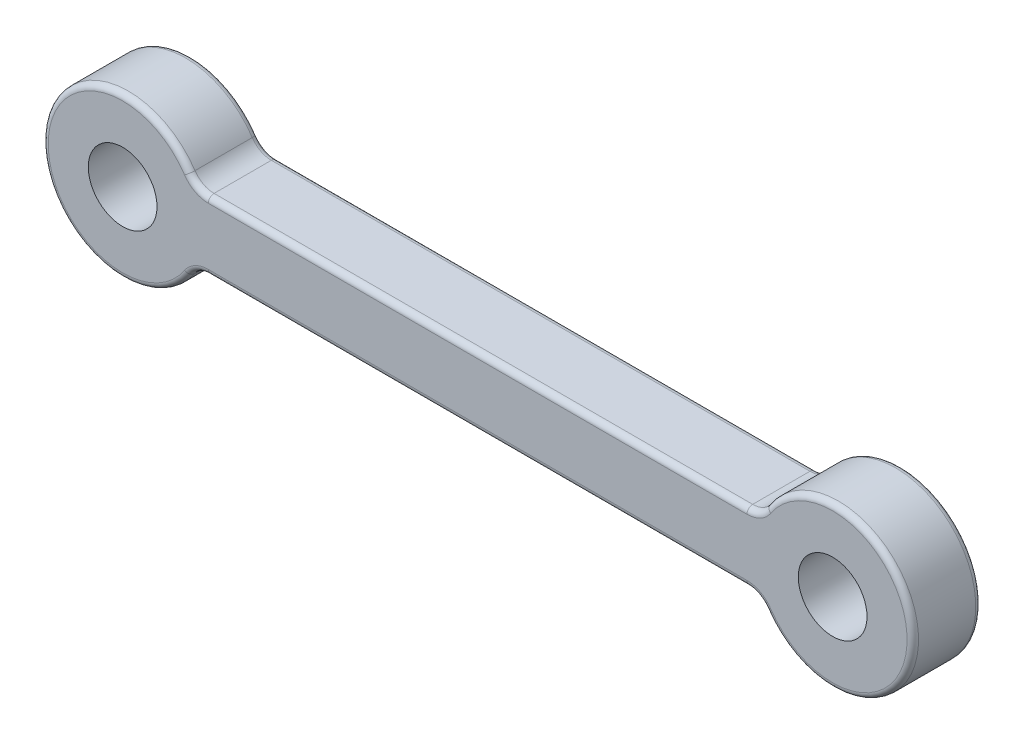
ISO-10303-21;
HEADER;
FILE_DESCRIPTION(('STEP AP214'),'2;1');
FILE_NAME('part.step','',(''),(''),'','','');
FILE_SCHEMA(('AUTOMOTIVE_DESIGN { 1 0 10303 214 1 1 1 1 }'));
ENDSEC;
DATA;
#1=APPLICATION_CONTEXT('core data for automotive mechanical design processes');
#2=APPLICATION_PROTOCOL_DEFINITION('international standard','automotive_design',2000,#1);
#3=PRODUCT_CONTEXT('',#1,'mechanical');
#4=PRODUCT('Part','Part','',(#3));
#5=PRODUCT_RELATED_PRODUCT_CATEGORY('part','',(#4));
#6=PRODUCT_DEFINITION_FORMATION('','',#4);
#7=PRODUCT_DEFINITION_CONTEXT('part definition',#1,'design');
#8=PRODUCT_DEFINITION('design','',#6,#7);
#9=PRODUCT_DEFINITION_SHAPE('','',#8);
#10=(LENGTH_UNIT() NAMED_UNIT(*) SI_UNIT(.MILLI.,.METRE.));
#11=(NAMED_UNIT(*) PLANE_ANGLE_UNIT() SI_UNIT($,.RADIAN.));
#12=(NAMED_UNIT(*) SI_UNIT($,.STERADIAN.) SOLID_ANGLE_UNIT());
#13=UNCERTAINTY_MEASURE_WITH_UNIT(LENGTH_MEASURE(1.E-05),#10,'distance_accuracy_value','');
#14=(GEOMETRIC_REPRESENTATION_CONTEXT(3) GLOBAL_UNCERTAINTY_ASSIGNED_CONTEXT((#13)) GLOBAL_UNIT_ASSIGNED_CONTEXT((#10,
#11,#12)) REPRESENTATION_CONTEXT('',''));
#15=CARTESIAN_POINT('',(0.,0.,0.));
#16=DIRECTION('',(0.,0.,1.));
#17=DIRECTION('',(1.,0.,0.));
#18=AXIS2_PLACEMENT_3D('',#15,#16,#17);
#19=CARTESIAN_POINT('',(0.,0.,3.));
#20=DIRECTION('',(0.,0.,-1.));
#21=DIRECTION('',(-1.,0.,0.));
#22=AXIS2_PLACEMENT_3D('',#19,#20,#21);
#23=CYLINDRICAL_SURFACE('',#22,3.5);
#24=DIRECTION('',(0.,0.,-1.));
#25=VECTOR('',#24,1.);
#26=CARTESIAN_POINT('',(2.91017796749084,-1.94444444444444,3.));
#27=LINE('',#26,#25);
#28=CARTESIAN_POINT('',(2.91017796749084,-1.94444444444444,0.25));
#29=VERTEX_POINT('',#28);
#30=CARTESIAN_POINT('',(2.91017796749084,-1.94444444444444,2.75));
#31=VERTEX_POINT('',#30);
#32=EDGE_CURVE('E294',#29,#31,#27,.F.);
#33=ORIENTED_EDGE('',*,*,#32,.T.);
#34=CARTESIAN_POINT('',(0.,0.,2.75));
#35=DIRECTION('',(0.,0.,1.));
#36=DIRECTION('',(1.,0.,0.));
#37=AXIS2_PLACEMENT_3D('',#34,#35,#36);
#38=CIRCLE('',#37,3.5);
#39=CARTESIAN_POINT('',(2.91017796749084,1.94444444444444,2.75));
#40=VERTEX_POINT('',#39);
#41=EDGE_CURVE('E216',#31,#40,#38,.F.);
#42=ORIENTED_EDGE('',*,*,#41,.T.);
#43=DIRECTION('',(0.,0.,-1.));
#44=VECTOR('',#43,1.);
#45=CARTESIAN_POINT('',(2.91017796749084,1.94444444444444,3.));
#46=LINE('',#45,#44);
#47=CARTESIAN_POINT('',(2.91017796749084,1.94444444444444,0.25));
#48=VERTEX_POINT('',#47);
#49=EDGE_CURVE('E300',#40,#48,#46,.T.);
#50=ORIENTED_EDGE('',*,*,#49,.T.);
#51=CARTESIAN_POINT('',(0.,0.,0.25));
#52=DIRECTION('',(0.,0.,1.));
#53=DIRECTION('',(1.,0.,0.));
#54=AXIS2_PLACEMENT_3D('',#51,#52,#53);
#55=CIRCLE('',#54,3.5);
#56=EDGE_CURVE('E214',#48,#29,#55,.T.);
#57=ORIENTED_EDGE('',*,*,#56,.T.);
#58=EDGE_LOOP('',(#33,#42,#50,#57));
#59=FACE_BOUND('',#58,.T.);
#60=ADVANCED_FACE('F46',(#59),#23,.T.);
#61=CARTESIAN_POINT('',(0.,-1.5,3.));
#62=DIRECTION('',(0.,-1.,0.));
#63=DIRECTION('',(0.,0.,-1.));
#64=AXIS2_PLACEMENT_3D('',#61,#62,#63);
#65=PLANE('',#64);
#66=DIRECTION('',(0.,0.,1.));
#67=VECTOR('',#66,1.);
#68=CARTESIAN_POINT('',(27.2583426132261,-1.5,3.));
#69=LINE('',#68,#67);
#70=CARTESIAN_POINT('',(27.2583426132261,-1.5,0.25));
#71=VERTEX_POINT('',#70);
#72=CARTESIAN_POINT('',(27.2583426132261,-1.5,2.75));
#73=VERTEX_POINT('',#72);
#74=EDGE_CURVE('E301',#71,#73,#69,.T.);
#75=ORIENTED_EDGE('',*,*,#74,.T.);
#76=DIRECTION('',(-1.,0.,0.));
#77=VECTOR('',#76,1.);
#78=CARTESIAN_POINT('',(0.,-1.5,2.75));
#79=LINE('',#78,#77);
#80=CARTESIAN_POINT('',(3.74165738677394,-1.5,2.75));
#81=VERTEX_POINT('',#80);
#82=EDGE_CURVE('E208',#73,#81,#79,.T.);
#83=ORIENTED_EDGE('',*,*,#82,.T.);
#84=DIRECTION('',(0.,0.,-1.));
#85=VECTOR('',#84,1.);
#86=CARTESIAN_POINT('',(3.74165738677394,-1.5,3.));
#87=LINE('',#86,#85);
#88=CARTESIAN_POINT('',(3.74165738677394,-1.5,0.25));
#89=VERTEX_POINT('',#88);
#90=EDGE_CURVE('E291',#81,#89,#87,.T.);
#91=ORIENTED_EDGE('',*,*,#90,.T.);
#92=DIRECTION('',(-1.,0.,0.));
#93=VECTOR('',#92,1.);
#94=CARTESIAN_POINT('',(27.2583426132261,-1.5,0.25));
#95=LINE('',#94,#93);
#96=EDGE_CURVE('E206',#89,#71,#95,.F.);
#97=ORIENTED_EDGE('',*,*,#96,.T.);
#98=EDGE_LOOP('',(#75,#83,#91,#97));
#99=FACE_BOUND('',#98,.T.);
#100=ADVANCED_FACE('F297',(#99),#65,.T.);
#101=CARTESIAN_POINT('',(31.,0.,3.));
#102=DIRECTION('',(0.,0.,-1.));
#103=DIRECTION('',(-1.,0.,0.));
#104=AXIS2_PLACEMENT_3D('',#101,#102,#103);
#105=CYLINDRICAL_SURFACE('',#104,3.5);
#106=DIRECTION('',(0.,0.,-1.));
#107=VECTOR('',#106,1.);
#108=CARTESIAN_POINT('',(28.0898220325092,1.94444444444445,3.));
#109=LINE('',#108,#107);
#110=CARTESIAN_POINT('',(28.0898220325092,1.94444444444445,0.25));
#111=VERTEX_POINT('',#110);
#112=CARTESIAN_POINT('',(28.0898220325092,1.94444444444445,2.75));
#113=VERTEX_POINT('',#112);
#114=EDGE_CURVE('E182',#111,#113,#109,.F.);
#115=ORIENTED_EDGE('',*,*,#114,.T.);
#116=CARTESIAN_POINT('',(31.,0.,2.75));
#117=DIRECTION('',(0.,0.,1.));
#118=DIRECTION('',(1.,0.,0.));
#119=AXIS2_PLACEMENT_3D('',#116,#117,#118);
#120=CIRCLE('',#119,3.5);
#121=CARTESIAN_POINT('',(28.0898220325092,-1.94444444444445,2.75));
#122=VERTEX_POINT('',#121);
#123=EDGE_CURVE('E200',#113,#122,#120,.F.);
#124=ORIENTED_EDGE('',*,*,#123,.T.);
#125=DIRECTION('',(0.,0.,-1.));
#126=VECTOR('',#125,1.);
#127=CARTESIAN_POINT('',(28.0898220325092,-1.94444444444445,3.));
#128=LINE('',#127,#126);
#129=CARTESIAN_POINT('',(28.0898220325092,-1.94444444444445,0.25));
#130=VERTEX_POINT('',#129);
#131=EDGE_CURVE('E316',#122,#130,#128,.T.);
#132=ORIENTED_EDGE('',*,*,#131,.T.);
#133=CARTESIAN_POINT('',(31.,0.,0.25));
#134=DIRECTION('',(0.,0.,1.));
#135=DIRECTION('',(1.,0.,0.));
#136=AXIS2_PLACEMENT_3D('',#133,#134,#135);
#137=CIRCLE('',#136,3.5);
#138=EDGE_CURVE('E198',#130,#111,#137,.T.);
#139=ORIENTED_EDGE('',*,*,#138,.T.);
#140=EDGE_LOOP('',(#115,#124,#132,#139));
#141=FACE_BOUND('',#140,.T.);
#142=ADVANCED_FACE('F343',(#141),#105,.T.);
#143=CARTESIAN_POINT('',(0.,1.5,3.));
#144=DIRECTION('',(0.,-1.,0.));
#145=DIRECTION('',(0.,0.,-1.));
#146=AXIS2_PLACEMENT_3D('',#143,#144,#145);
#147=PLANE('',#146);
#148=DIRECTION('',(0.,0.,1.));
#149=VECTOR('',#148,1.);
#150=CARTESIAN_POINT('',(3.74165738677394,1.5,3.));
#151=LINE('',#150,#149);
#152=CARTESIAN_POINT('',(3.74165738677394,1.5,0.25));
#153=VERTEX_POINT('',#152);
#154=CARTESIAN_POINT('',(3.74165738677394,1.5,2.75));
#155=VERTEX_POINT('',#154);
#156=EDGE_CURVE('E313',#153,#155,#151,.T.);
#157=ORIENTED_EDGE('',*,*,#156,.T.);
#158=DIRECTION('',(-1.,0.,0.));
#159=VECTOR('',#158,1.);
#160=CARTESIAN_POINT('',(27.2583426132261,1.5,2.75));
#161=LINE('',#160,#159);
#162=CARTESIAN_POINT('',(27.2583426132261,1.5,2.75));
#163=VERTEX_POINT('',#162);
#164=EDGE_CURVE('E11',#155,#163,#161,.F.);
#165=ORIENTED_EDGE('',*,*,#164,.T.);
#166=DIRECTION('',(0.,0.,-1.));
#167=VECTOR('',#166,1.);
#168=CARTESIAN_POINT('',(27.2583426132261,1.5,3.));
#169=LINE('',#168,#167);
#170=CARTESIAN_POINT('',(27.2583426132261,1.5,0.25));
#171=VERTEX_POINT('',#170);
#172=EDGE_CURVE('E310',#163,#171,#169,.T.);
#173=ORIENTED_EDGE('',*,*,#172,.T.);
#174=DIRECTION('',(-1.,0.,0.));
#175=VECTOR('',#174,1.);
#176=CARTESIAN_POINT('',(0.,1.5,0.25));
#177=LINE('',#176,#175);
#178=EDGE_CURVE('E55',#171,#153,#177,.T.);
#179=ORIENTED_EDGE('',*,*,#178,.T.);
#180=EDGE_LOOP('',(#157,#165,#173,#179));
#181=FACE_BOUND('',#180,.T.);
#182=ADVANCED_FACE('F359',(#181),#147,.F.);
#183=CARTESIAN_POINT('',(0.,0.,3.));
#184=DIRECTION('',(0.,0.,-1.));
#185=DIRECTION('',(-1.,0.,0.));
#186=AXIS2_PLACEMENT_3D('',#183,#184,#185);
#187=CYLINDRICAL_SURFACE('',#186,1.5);
#188=CARTESIAN_POINT('',(0.,0.,3.));
#189=DIRECTION('',(0.,0.,1.));
#190=DIRECTION('',(1.,0.,0.));
#191=AXIS2_PLACEMENT_3D('',#188,#189,#190);
#192=CIRCLE('',#191,1.5);
#193=CARTESIAN_POINT('',(1.5,0.,3.));
#194=VERTEX_POINT('',#193);
#195=EDGE_CURVE('E694',#194,#194,#192,.T.);
#196=ORIENTED_EDGE('',*,*,#195,.T.);
#197=EDGE_LOOP('',(#196));
#198=FACE_BOUND('',#197,.T.);
#199=CARTESIAN_POINT('',(0.,0.,0.));
#200=DIRECTION('',(0.,0.,1.));
#201=DIRECTION('',(1.,0.,0.));
#202=AXIS2_PLACEMENT_3D('',#199,#200,#201);
#203=CIRCLE('',#202,1.5);
#204=CARTESIAN_POINT('',(1.5,0.,0.));
#205=VERTEX_POINT('',#204);
#206=EDGE_CURVE('E255',#205,#205,#203,.T.);
#207=ORIENTED_EDGE('',*,*,#206,.F.);
#208=EDGE_LOOP('',(#207));
#209=FACE_BOUND('',#208,.T.);
#210=ADVANCED_FACE('F395',(#198,#209),#187,.F.);
#211=CARTESIAN_POINT('',(31.,0.,3.));
#212=DIRECTION('',(0.,0.,-1.));
#213=DIRECTION('',(-1.,0.,0.));
#214=AXIS2_PLACEMENT_3D('',#211,#212,#213);
#215=CYLINDRICAL_SURFACE('',#214,1.5);
#216=CARTESIAN_POINT('',(31.,0.,3.));
#217=DIRECTION('',(0.,0.,1.));
#218=DIRECTION('',(1.,0.,0.));
#219=AXIS2_PLACEMENT_3D('',#216,#217,#218);
#220=CIRCLE('',#219,1.5);
#221=CARTESIAN_POINT('',(32.5,0.,3.));
#222=VERTEX_POINT('',#221);
#223=EDGE_CURVE('E305',#222,#222,#220,.F.);
#224=ORIENTED_EDGE('',*,*,#223,.F.);
#225=EDGE_LOOP('',(#224));
#226=FACE_BOUND('',#225,.T.);
#227=CARTESIAN_POINT('',(31.,0.,0.));
#228=DIRECTION('',(0.,0.,1.));
#229=DIRECTION('',(1.,0.,0.));
#230=AXIS2_PLACEMENT_3D('',#227,#228,#229);
#231=CIRCLE('',#230,1.5);
#232=CARTESIAN_POINT('',(32.5,0.,0.));
#233=VERTEX_POINT('',#232);
#234=EDGE_CURVE('E692',#233,#233,#231,.F.);
#235=ORIENTED_EDGE('',*,*,#234,.T.);
#236=EDGE_LOOP('',(#235));
#237=FACE_BOUND('',#236,.T.);
#238=ADVANCED_FACE('F398',(#226,#237),#215,.F.);
#239=CARTESIAN_POINT('',(0.,0.,3.));
#240=DIRECTION('',(0.,0.,1.));
#241=DIRECTION('',(1.,0.,0.));
#242=AXIS2_PLACEMENT_3D('',#239,#240,#241);
#243=PLANE('',#242);
#244=CARTESIAN_POINT('',(31.,0.,3.));
#245=DIRECTION('',(0.,0.,1.));
#246=DIRECTION('',(1.,0.,0.));
#247=AXIS2_PLACEMENT_3D('',#244,#245,#246);
#248=CIRCLE('',#247,3.25);
#249=CARTESIAN_POINT('',(28.2976918873299,-1.80555555555556,3.));
#250=VERTEX_POINT('',#249);
#251=CARTESIAN_POINT('',(28.2976918873299,1.80555555555556,3.));
#252=VERTEX_POINT('',#251);
#253=EDGE_CURVE('E187',#250,#252,#248,.T.);
#254=ORIENTED_EDGE('',*,*,#253,.T.);
#255=CARTESIAN_POINT('',(27.2583426132261,2.5,3.));
#256=DIRECTION('',(0.,0.,1.));
#257=DIRECTION('',(1.,0.,0.));
#258=AXIS2_PLACEMENT_3D('',#255,#256,#257);
#259=CIRCLE('',#258,1.25);
#260=CARTESIAN_POINT('',(27.2583426132261,1.25,3.));
#261=VERTEX_POINT('',#260);
#262=EDGE_CURVE('E167',#252,#261,#259,.F.);
#263=ORIENTED_EDGE('',*,*,#262,.T.);
#264=DIRECTION('',(-1.,0.,0.));
#265=VECTOR('',#264,1.);
#266=CARTESIAN_POINT('',(3.74165738677394,1.25,3.));
#267=LINE('',#266,#265);
#268=CARTESIAN_POINT('',(3.74165738677394,1.25,3.));
#269=VERTEX_POINT('',#268);
#270=EDGE_CURVE('E175',#261,#269,#267,.T.);
#271=ORIENTED_EDGE('',*,*,#270,.T.);
#272=CARTESIAN_POINT('',(3.74165738677394,2.5,3.));
#273=DIRECTION('',(0.,0.,1.));
#274=DIRECTION('',(1.,0.,0.));
#275=AXIS2_PLACEMENT_3D('',#272,#273,#274);
#276=CIRCLE('',#275,1.25);
#277=CARTESIAN_POINT('',(2.70230811267007,1.80555555555556,3.));
#278=VERTEX_POINT('',#277);
#279=EDGE_CURVE('E181',#269,#278,#276,.F.);
#280=ORIENTED_EDGE('',*,*,#279,.T.);
#281=CARTESIAN_POINT('',(0.,0.,3.));
#282=DIRECTION('',(0.,0.,1.));
#283=DIRECTION('',(1.,0.,0.));
#284=AXIS2_PLACEMENT_3D('',#281,#282,#283);
#285=CIRCLE('',#284,3.25);
#286=CARTESIAN_POINT('',(2.70230811267007,-1.80555555555556,3.));
#287=VERTEX_POINT('',#286);
#288=EDGE_CURVE('E322',#278,#287,#285,.T.);
#289=ORIENTED_EDGE('',*,*,#288,.T.);
#290=CARTESIAN_POINT('',(3.74165738677394,-2.5,3.));
#291=DIRECTION('',(0.,0.,1.));
#292=DIRECTION('',(1.,0.,0.));
#293=AXIS2_PLACEMENT_3D('',#290,#291,#292);
#294=CIRCLE('',#293,1.25);
#295=CARTESIAN_POINT('',(3.74165738677394,-1.25,3.));
#296=VERTEX_POINT('',#295);
#297=EDGE_CURVE('E324',#287,#296,#294,.F.);
#298=ORIENTED_EDGE('',*,*,#297,.T.);
#299=DIRECTION('',(-1.,0.,0.));
#300=VECTOR('',#299,1.);
#301=CARTESIAN_POINT('',(0.,-1.25,3.));
#302=LINE('',#301,#300);
#303=CARTESIAN_POINT('',(27.2583426132261,-1.25,3.));
#304=VERTEX_POINT('',#303);
#305=EDGE_CURVE('E326',#296,#304,#302,.F.);
#306=ORIENTED_EDGE('',*,*,#305,.T.);
#307=CARTESIAN_POINT('',(27.2583426132261,-2.5,3.));
#308=DIRECTION('',(0.,0.,1.));
#309=DIRECTION('',(1.,0.,0.));
#310=AXIS2_PLACEMENT_3D('',#307,#308,#309);
#311=CIRCLE('',#310,1.25);
#312=EDGE_CURVE('E193',#304,#250,#311,.F.);
#313=ORIENTED_EDGE('',*,*,#312,.T.);
#314=EDGE_LOOP('',(#254,#263,#271,#280,#289,#298,#306,#313));
#315=FACE_BOUND('',#314,.T.);
#316=ORIENTED_EDGE('',*,*,#195,.F.);
#317=EDGE_LOOP('',(#316));
#318=FACE_BOUND('',#317,.T.);
#319=ORIENTED_EDGE('',*,*,#223,.T.);
#320=EDGE_LOOP('',(#319));
#321=FACE_BOUND('',#320,.T.);
#322=ADVANCED_FACE('F184',(#315,#318,#321),#243,.T.);
#323=CARTESIAN_POINT('',(0.,0.,0.));
#324=DIRECTION('',(0.,0.,1.));
#325=DIRECTION('',(1.,0.,0.));
#326=AXIS2_PLACEMENT_3D('',#323,#324,#325);
#327=PLANE('',#326);
#328=DIRECTION('',(-1.,0.,0.));
#329=VECTOR('',#328,1.);
#330=CARTESIAN_POINT('',(0.,1.25,0.));
#331=LINE('',#330,#329);
#332=CARTESIAN_POINT('',(3.74165738677394,1.25,0.));
#333=VERTEX_POINT('',#332);
#334=CARTESIAN_POINT('',(27.2583426132261,1.25,0.));
#335=VERTEX_POINT('',#334);
#336=EDGE_CURVE('E222',#333,#335,#331,.F.);
#337=ORIENTED_EDGE('',*,*,#336,.T.);
#338=CARTESIAN_POINT('',(27.2583426132261,2.5,0.));
#339=DIRECTION('',(0.,0.,1.));
#340=DIRECTION('',(1.,0.,0.));
#341=AXIS2_PLACEMENT_3D('',#338,#339,#340);
#342=CIRCLE('',#341,1.25);
#343=CARTESIAN_POINT('',(28.2976918873299,1.80555555555556,0.));
#344=VERTEX_POINT('',#343);
#345=EDGE_CURVE('E235',#335,#344,#342,.T.);
#346=ORIENTED_EDGE('',*,*,#345,.T.);
#347=CARTESIAN_POINT('',(31.,0.,0.));
#348=DIRECTION('',(0.,0.,1.));
#349=DIRECTION('',(1.,0.,0.));
#350=AXIS2_PLACEMENT_3D('',#347,#348,#349);
#351=CIRCLE('',#350,3.25);
#352=CARTESIAN_POINT('',(28.2976918873299,-1.80555555555556,0.));
#353=VERTEX_POINT('',#352);
#354=EDGE_CURVE('E70',#344,#353,#351,.F.);
#355=ORIENTED_EDGE('',*,*,#354,.T.);
#356=CARTESIAN_POINT('',(27.2583426132261,-2.5,0.));
#357=DIRECTION('',(0.,0.,1.));
#358=DIRECTION('',(1.,0.,0.));
#359=AXIS2_PLACEMENT_3D('',#356,#357,#358);
#360=CIRCLE('',#359,1.25);
#361=CARTESIAN_POINT('',(27.2583426132261,-1.25,0.));
#362=VERTEX_POINT('',#361);
#363=EDGE_CURVE('E232',#353,#362,#360,.T.);
#364=ORIENTED_EDGE('',*,*,#363,.T.);
#365=DIRECTION('',(-1.,0.,0.));
#366=VECTOR('',#365,1.);
#367=CARTESIAN_POINT('',(3.74165738677394,-1.25,0.));
#368=LINE('',#367,#366);
#369=CARTESIAN_POINT('',(3.74165738677394,-1.25,0.));
#370=VERTEX_POINT('',#369);
#371=EDGE_CURVE('E230',#362,#370,#368,.T.);
#372=ORIENTED_EDGE('',*,*,#371,.T.);
#373=CARTESIAN_POINT('',(3.74165738677394,-2.5,0.));
#374=DIRECTION('',(0.,0.,1.));
#375=DIRECTION('',(1.,0.,0.));
#376=AXIS2_PLACEMENT_3D('',#373,#374,#375);
#377=CIRCLE('',#376,1.25);
#378=CARTESIAN_POINT('',(2.70230811267007,-1.80555555555556,0.));
#379=VERTEX_POINT('',#378);
#380=EDGE_CURVE('E228',#370,#379,#377,.T.);
#381=ORIENTED_EDGE('',*,*,#380,.T.);
#382=CARTESIAN_POINT('',(0.,0.,0.));
#383=DIRECTION('',(0.,0.,1.));
#384=DIRECTION('',(1.,0.,0.));
#385=AXIS2_PLACEMENT_3D('',#382,#383,#384);
#386=CIRCLE('',#385,3.25);
#387=CARTESIAN_POINT('',(2.70230811267007,1.80555555555556,0.));
#388=VERTEX_POINT('',#387);
#389=EDGE_CURVE('E226',#379,#388,#386,.F.);
#390=ORIENTED_EDGE('',*,*,#389,.T.);
#391=CARTESIAN_POINT('',(3.74165738677394,2.5,0.));
#392=DIRECTION('',(0.,0.,1.));
#393=DIRECTION('',(1.,0.,0.));
#394=AXIS2_PLACEMENT_3D('',#391,#392,#393);
#395=CIRCLE('',#394,1.25);
#396=EDGE_CURVE('E224',#388,#333,#395,.T.);
#397=ORIENTED_EDGE('',*,*,#396,.T.);
#398=EDGE_LOOP('',(#337,#346,#355,#364,#372,#381,#390,#397));
#399=FACE_BOUND('',#398,.T.);
#400=ORIENTED_EDGE('',*,*,#206,.T.);
#401=EDGE_LOOP('',(#400));
#402=FACE_BOUND('',#401,.T.);
#403=ORIENTED_EDGE('',*,*,#234,.F.);
#404=EDGE_LOOP('',(#403));
#405=FACE_BOUND('',#404,.T.);
#406=ADVANCED_FACE('F348',(#399,#402,#405),#327,.F.);
#407=CARTESIAN_POINT('',(3.74165738677394,-2.5,3.));
#408=DIRECTION('',(0.,0.,-1.));
#409=DIRECTION('',(-1.,0.,0.));
#410=AXIS2_PLACEMENT_3D('',#407,#408,#409);
#411=CYLINDRICAL_SURFACE('',#410,1.);
#412=ORIENTED_EDGE('',*,*,#90,.F.);
#413=CARTESIAN_POINT('',(3.74165738677394,-2.5,2.75));
#414=DIRECTION('',(0.,0.,1.));
#415=DIRECTION('',(1.,0.,0.));
#416=AXIS2_PLACEMENT_3D('',#413,#414,#415);
#417=CIRCLE('',#416,1.);
#418=EDGE_CURVE('E212',#81,#31,#417,.T.);
#419=ORIENTED_EDGE('',*,*,#418,.T.);
#420=ORIENTED_EDGE('',*,*,#32,.F.);
#421=CARTESIAN_POINT('',(3.74165738677394,-2.5,0.25));
#422=DIRECTION('',(0.,0.,1.));
#423=DIRECTION('',(1.,0.,0.));
#424=AXIS2_PLACEMENT_3D('',#421,#422,#423);
#425=CIRCLE('',#424,1.);
#426=EDGE_CURVE('E210',#29,#89,#425,.F.);
#427=ORIENTED_EDGE('',*,*,#426,.T.);
#428=EDGE_LOOP('',(#412,#419,#420,#427));
#429=FACE_BOUND('',#428,.T.);
#430=ADVANCED_FACE('F290',(#429),#411,.F.);
#431=CARTESIAN_POINT('',(3.74165738677394,2.5,3.));
#432=DIRECTION('',(0.,0.,-1.));
#433=DIRECTION('',(-1.,0.,0.));
#434=AXIS2_PLACEMENT_3D('',#431,#432,#433);
#435=CYLINDRICAL_SURFACE('',#434,1.);
#436=ORIENTED_EDGE('',*,*,#49,.F.);
#437=CARTESIAN_POINT('',(3.74165738677394,2.5,2.75));
#438=DIRECTION('',(0.,0.,1.));
#439=DIRECTION('',(1.,0.,0.));
#440=AXIS2_PLACEMENT_3D('',#437,#438,#439);
#441=CIRCLE('',#440,1.);
#442=EDGE_CURVE('E220',#40,#155,#441,.T.);
#443=ORIENTED_EDGE('',*,*,#442,.T.);
#444=ORIENTED_EDGE('',*,*,#156,.F.);
#445=CARTESIAN_POINT('',(3.74165738677394,2.5,0.25));
#446=DIRECTION('',(0.,0.,1.));
#447=DIRECTION('',(1.,0.,0.));
#448=AXIS2_PLACEMENT_3D('',#445,#446,#447);
#449=CIRCLE('',#448,1.);
#450=EDGE_CURVE('E218',#153,#48,#449,.F.);
#451=ORIENTED_EDGE('',*,*,#450,.T.);
#452=EDGE_LOOP('',(#436,#443,#444,#451));
#453=FACE_BOUND('',#452,.T.);
#454=ADVANCED_FACE('F402',(#453),#435,.F.);
#455=CARTESIAN_POINT('',(27.2583426132261,2.5,3.));
#456=DIRECTION('',(0.,0.,-1.));
#457=DIRECTION('',(-1.,0.,0.));
#458=AXIS2_PLACEMENT_3D('',#455,#456,#457);
#459=CYLINDRICAL_SURFACE('',#458,1.);
#460=ORIENTED_EDGE('',*,*,#172,.F.);
#461=CARTESIAN_POINT('',(27.2583426132261,2.5,2.75));
#462=DIRECTION('',(0.,0.,1.));
#463=DIRECTION('',(1.,0.,0.));
#464=AXIS2_PLACEMENT_3D('',#461,#462,#463);
#465=CIRCLE('',#464,1.);
#466=EDGE_CURVE('E169',#163,#113,#465,.T.);
#467=ORIENTED_EDGE('',*,*,#466,.T.);
#468=ORIENTED_EDGE('',*,*,#114,.F.);
#469=CARTESIAN_POINT('',(27.2583426132261,2.5,0.25));
#470=DIRECTION('',(0.,0.,1.));
#471=DIRECTION('',(1.,0.,0.));
#472=AXIS2_PLACEMENT_3D('',#469,#470,#471);
#473=CIRCLE('',#472,1.);
#474=EDGE_CURVE('E189',#111,#171,#473,.F.);
#475=ORIENTED_EDGE('',*,*,#474,.T.);
#476=EDGE_LOOP('',(#460,#467,#468,#475));
#477=FACE_BOUND('',#476,.T.);
#478=ADVANCED_FACE('F342',(#477),#459,.F.);
#479=CARTESIAN_POINT('',(27.2583426132261,-2.5,3.));
#480=DIRECTION('',(0.,0.,-1.));
#481=DIRECTION('',(-1.,0.,0.));
#482=AXIS2_PLACEMENT_3D('',#479,#480,#481);
#483=CYLINDRICAL_SURFACE('',#482,1.);
#484=ORIENTED_EDGE('',*,*,#131,.F.);
#485=CARTESIAN_POINT('',(27.2583426132261,-2.5,2.75));
#486=DIRECTION('',(0.,0.,1.));
#487=DIRECTION('',(1.,0.,0.));
#488=AXIS2_PLACEMENT_3D('',#485,#486,#487);
#489=CIRCLE('',#488,1.);
#490=EDGE_CURVE('E204',#122,#73,#489,.T.);
#491=ORIENTED_EDGE('',*,*,#490,.T.);
#492=ORIENTED_EDGE('',*,*,#74,.F.);
#493=CARTESIAN_POINT('',(27.2583426132261,-2.5,0.25));
#494=DIRECTION('',(0.,0.,1.));
#495=DIRECTION('',(1.,0.,0.));
#496=AXIS2_PLACEMENT_3D('',#493,#494,#495);
#497=CIRCLE('',#496,1.);
#498=EDGE_CURVE('E202',#71,#130,#497,.F.);
#499=ORIENTED_EDGE('',*,*,#498,.T.);
#500=EDGE_LOOP('',(#484,#491,#492,#499));
#501=FACE_BOUND('',#500,.T.);
#502=ADVANCED_FACE('F384',(#501),#483,.F.);
#503=CARTESIAN_POINT('',(3.74165738677394,-2.5,2.75));
#504=DIRECTION('',(0.,0.,1.));
#505=DIRECTION('',(1.,0.,0.));
#506=AXIS2_PLACEMENT_3D('',#503,#504,#505);
#507=TOROIDAL_SURFACE('',#506,1.25,0.25);
#508=CARTESIAN_POINT('',(2.70230811267007,-1.80555555555556,2.75));
#509=DIRECTION('',(-0.555555555555555,-0.831479419283098,0.));
#510=DIRECTION('',(0.831479419283098,-0.555555555555555,0.));
#511=AXIS2_PLACEMENT_3D('',#508,#509,#510);
#512=CIRCLE('',#511,0.25);
#513=EDGE_CURVE('E249',#31,#287,#512,.T.);
#514=ORIENTED_EDGE('',*,*,#513,.F.);
#515=ORIENTED_EDGE('',*,*,#418,.F.);
#516=CARTESIAN_POINT('',(3.74165738677394,-1.25,2.75));
#517=DIRECTION('',(1.,0.,0.));
#518=DIRECTION('',(0.,0.,-1.));
#519=AXIS2_PLACEMENT_3D('',#516,#517,#518);
#520=CIRCLE('',#519,0.25);
#521=EDGE_CURVE('E252',#296,#81,#520,.T.);
#522=ORIENTED_EDGE('',*,*,#521,.F.);
#523=ORIENTED_EDGE('',*,*,#297,.F.);
#524=EDGE_LOOP('',(#514,#515,#522,#523));
#525=FACE_BOUND('',#524,.T.);
#526=ADVANCED_FACE('F373',(#525),#507,.T.);
#527=CARTESIAN_POINT('',(0.,-1.25,2.75));
#528=DIRECTION('',(-1.,0.,0.));
#529=DIRECTION('',(0.,0.,1.));
#530=AXIS2_PLACEMENT_3D('',#527,#528,#529);
#531=CYLINDRICAL_SURFACE('',#530,0.25);
#532=ORIENTED_EDGE('',*,*,#521,.T.);
#533=ORIENTED_EDGE('',*,*,#82,.F.);
#534=CARTESIAN_POINT('',(27.2583426132261,-1.25,2.75));
#535=DIRECTION('',(1.,0.,0.));
#536=DIRECTION('',(0.,0.,-1.));
#537=AXIS2_PLACEMENT_3D('',#534,#535,#536);
#538=CIRCLE('',#537,0.25);
#539=EDGE_CURVE('E246',#304,#73,#538,.T.);
#540=ORIENTED_EDGE('',*,*,#539,.F.);
#541=ORIENTED_EDGE('',*,*,#305,.F.);
#542=EDGE_LOOP('',(#532,#533,#540,#541));
#543=FACE_BOUND('',#542,.T.);
#544=ADVANCED_FACE('F376',(#543),#531,.T.);
#545=CARTESIAN_POINT('',(0.,0.,2.75));
#546=DIRECTION('',(0.,0.,1.));
#547=DIRECTION('',(1.,0.,0.));
#548=AXIS2_PLACEMENT_3D('',#545,#546,#547);
#549=TOROIDAL_SURFACE('',#548,3.25,0.25);
#550=ORIENTED_EDGE('',*,*,#513,.T.);
#551=ORIENTED_EDGE('',*,*,#288,.F.);
#552=CARTESIAN_POINT('',(2.70230811267007,1.80555555555556,2.75));
#553=DIRECTION('',(0.555555555555556,-0.831479419283098,0.));
#554=DIRECTION('',(0.831479419283098,0.555555555555556,0.));
#555=AXIS2_PLACEMENT_3D('',#552,#553,#554);
#556=CIRCLE('',#555,0.25);
#557=EDGE_CURVE('E243',#40,#278,#556,.T.);
#558=ORIENTED_EDGE('',*,*,#557,.F.);
#559=ORIENTED_EDGE('',*,*,#41,.F.);
#560=EDGE_LOOP('',(#550,#551,#558,#559));
#561=FACE_BOUND('',#560,.T.);
#562=ADVANCED_FACE('F369',(#561),#549,.T.);
#563=CARTESIAN_POINT('',(27.2583426132261,-2.5,2.75));
#564=DIRECTION('',(0.,0.,1.));
#565=DIRECTION('',(1.,0.,0.));
#566=AXIS2_PLACEMENT_3D('',#563,#564,#565);
#567=TOROIDAL_SURFACE('',#566,1.25,0.25);
#568=ORIENTED_EDGE('',*,*,#539,.T.);
#569=ORIENTED_EDGE('',*,*,#490,.F.);
#570=CARTESIAN_POINT('',(28.2976918873299,-1.80555555555556,2.75));
#571=DIRECTION('',(0.55555555555555,-0.831479419283102,0.));
#572=DIRECTION('',(0.831479419283102,0.55555555555555,0.));
#573=AXIS2_PLACEMENT_3D('',#570,#571,#572);
#574=CIRCLE('',#573,0.25);
#575=EDGE_CURVE('E240',#250,#122,#574,.T.);
#576=ORIENTED_EDGE('',*,*,#575,.F.);
#577=ORIENTED_EDGE('',*,*,#312,.F.);
#578=EDGE_LOOP('',(#568,#569,#576,#577));
#579=FACE_BOUND('',#578,.T.);
#580=ADVANCED_FACE('F333',(#579),#567,.T.);
#581=CARTESIAN_POINT('',(3.74165738677394,2.5,2.75));
#582=DIRECTION('',(0.,0.,1.));
#583=DIRECTION('',(1.,0.,0.));
#584=AXIS2_PLACEMENT_3D('',#581,#582,#583);
#585=TOROIDAL_SURFACE('',#584,1.25,0.25);
#586=ORIENTED_EDGE('',*,*,#557,.T.);
#587=ORIENTED_EDGE('',*,*,#279,.F.);
#588=CARTESIAN_POINT('',(3.74165738677394,1.25,2.75));
#589=DIRECTION('',(1.,0.,0.));
#590=DIRECTION('',(0.,0.,-1.));
#591=AXIS2_PLACEMENT_3D('',#588,#589,#590);
#592=CIRCLE('',#591,0.25);
#593=EDGE_CURVE('E178',#155,#269,#592,.T.);
#594=ORIENTED_EDGE('',*,*,#593,.F.);
#595=ORIENTED_EDGE('',*,*,#442,.F.);
#596=EDGE_LOOP('',(#586,#587,#594,#595));
#597=FACE_BOUND('',#596,.T.);
#598=ADVANCED_FACE('F364',(#597),#585,.T.);
#599=CARTESIAN_POINT('',(31.,0.,2.75));
#600=DIRECTION('',(0.,0.,1.));
#601=DIRECTION('',(1.,0.,0.));
#602=AXIS2_PLACEMENT_3D('',#599,#600,#601);
#603=TOROIDAL_SURFACE('',#602,3.25,0.25);
#604=ORIENTED_EDGE('',*,*,#575,.T.);
#605=ORIENTED_EDGE('',*,*,#123,.F.);
#606=CARTESIAN_POINT('',(28.2976918873299,1.80555555555556,2.75));
#607=DIRECTION('',(-0.55555555555555,-0.831479419283102,0.));
#608=DIRECTION('',(0.831479419283102,-0.55555555555555,0.));
#609=AXIS2_PLACEMENT_3D('',#606,#607,#608);
#610=CIRCLE('',#609,0.25);
#611=EDGE_CURVE('E172',#252,#113,#610,.T.);
#612=ORIENTED_EDGE('',*,*,#611,.F.);
#613=ORIENTED_EDGE('',*,*,#253,.F.);
#614=EDGE_LOOP('',(#604,#605,#612,#613));
#615=FACE_BOUND('',#614,.T.);
#616=ADVANCED_FACE('F336',(#615),#603,.T.);
#617=CARTESIAN_POINT('',(0.,1.25,2.75));
#618=DIRECTION('',(1.,0.,0.));
#619=DIRECTION('',(0.,0.,-1.));
#620=AXIS2_PLACEMENT_3D('',#617,#618,#619);
#621=CYLINDRICAL_SURFACE('',#620,0.25);
#622=ORIENTED_EDGE('',*,*,#593,.T.);
#623=ORIENTED_EDGE('',*,*,#270,.F.);
#624=CARTESIAN_POINT('',(27.2583426132261,1.25,2.75));
#625=DIRECTION('',(1.,0.,0.));
#626=DIRECTION('',(0.,0.,-1.));
#627=AXIS2_PLACEMENT_3D('',#624,#625,#626);
#628=CIRCLE('',#627,0.25);
#629=EDGE_CURVE('E163',#163,#261,#628,.T.);
#630=ORIENTED_EDGE('',*,*,#629,.F.);
#631=ORIENTED_EDGE('',*,*,#164,.F.);
#632=EDGE_LOOP('',(#622,#623,#630,#631));
#633=FACE_BOUND('',#632,.T.);
#634=ADVANCED_FACE('F176',(#633),#621,.T.);
#635=CARTESIAN_POINT('',(27.2583426132261,2.5,2.75));
#636=DIRECTION('',(0.,0.,1.));
#637=DIRECTION('',(1.,0.,0.));
#638=AXIS2_PLACEMENT_3D('',#635,#636,#637);
#639=TOROIDAL_SURFACE('',#638,1.25,0.25);
#640=ORIENTED_EDGE('',*,*,#611,.T.);
#641=ORIENTED_EDGE('',*,*,#466,.F.);
#642=ORIENTED_EDGE('',*,*,#629,.T.);
#643=ORIENTED_EDGE('',*,*,#262,.F.);
#644=EDGE_LOOP('',(#640,#641,#642,#643));
#645=FACE_BOUND('',#644,.T.);
#646=ADVANCED_FACE('F165',(#645),#639,.T.);
#647=CARTESIAN_POINT('',(3.74165738677394,-2.5,0.25));
#648=DIRECTION('',(0.,0.,1.));
#649=DIRECTION('',(1.,0.,0.));
#650=AXIS2_PLACEMENT_3D('',#647,#648,#649);
#651=TOROIDAL_SURFACE('',#650,1.25,0.25);
#652=CARTESIAN_POINT('',(3.74165738677394,-1.25,0.25));
#653=DIRECTION('',(1.,0.,0.));
#654=DIRECTION('',(0.,0.,-1.));
#655=AXIS2_PLACEMENT_3D('',#652,#653,#654);
#656=CIRCLE('',#655,0.25);
#657=EDGE_CURVE('E270',#89,#370,#656,.T.);
#658=ORIENTED_EDGE('',*,*,#657,.F.);
#659=ORIENTED_EDGE('',*,*,#426,.F.);
#660=CARTESIAN_POINT('',(2.70230811267007,-1.80555555555556,0.25));
#661=DIRECTION('',(-0.555555555555554,-0.831479419283099,0.));
#662=DIRECTION('',(0.831479419283099,-0.555555555555555,0.));
#663=AXIS2_PLACEMENT_3D('',#660,#661,#662);
#664=CIRCLE('',#663,0.25);
#665=EDGE_CURVE('E50',#379,#29,#664,.T.);
#666=ORIENTED_EDGE('',*,*,#665,.F.);
#667=ORIENTED_EDGE('',*,*,#380,.F.);
#668=EDGE_LOOP('',(#658,#659,#666,#667));
#669=FACE_BOUND('',#668,.T.);
#670=ADVANCED_FACE('F48',(#669),#651,.T.);
#671=CARTESIAN_POINT('',(0.,0.,0.25));
#672=DIRECTION('',(0.,0.,1.));
#673=DIRECTION('',(1.,0.,0.));
#674=AXIS2_PLACEMENT_3D('',#671,#672,#673);
#675=TOROIDAL_SURFACE('',#674,3.25,0.25);
#676=ORIENTED_EDGE('',*,*,#665,.T.);
#677=ORIENTED_EDGE('',*,*,#56,.F.);
#678=CARTESIAN_POINT('',(2.70230811267007,1.80555555555556,0.25));
#679=DIRECTION('',(0.555555555555556,-0.831479419283098,0.));
#680=DIRECTION('',(0.831479419283098,0.555555555555556,0.));
#681=AXIS2_PLACEMENT_3D('',#678,#679,#680);
#682=CIRCLE('',#681,0.25);
#683=EDGE_CURVE('E268',#388,#48,#682,.T.);
#684=ORIENTED_EDGE('',*,*,#683,.F.);
#685=ORIENTED_EDGE('',*,*,#389,.F.);
#686=EDGE_LOOP('',(#676,#677,#684,#685));
#687=FACE_BOUND('',#686,.T.);
#688=ADVANCED_FACE('F281',(#687),#675,.T.);
#689=CARTESIAN_POINT('',(0.,-1.25,0.25));
#690=DIRECTION('',(1.,0.,0.));
#691=DIRECTION('',(0.,0.,-1.));
#692=AXIS2_PLACEMENT_3D('',#689,#690,#691);
#693=CYLINDRICAL_SURFACE('',#692,0.25);
#694=ORIENTED_EDGE('',*,*,#657,.T.);
#695=ORIENTED_EDGE('',*,*,#371,.F.);
#696=CARTESIAN_POINT('',(27.2583426132261,-1.25,0.25));
#697=DIRECTION('',(1.,0.,0.));
#698=DIRECTION('',(0.,0.,-1.));
#699=AXIS2_PLACEMENT_3D('',#696,#697,#698);
#700=CIRCLE('',#699,0.25);
#701=EDGE_CURVE('E265',#71,#362,#700,.T.);
#702=ORIENTED_EDGE('',*,*,#701,.F.);
#703=ORIENTED_EDGE('',*,*,#96,.F.);
#704=EDGE_LOOP('',(#694,#695,#702,#703));
#705=FACE_BOUND('',#704,.T.);
#706=ADVANCED_FACE('F450',(#705),#693,.T.);
#707=CARTESIAN_POINT('',(3.74165738677394,2.5,0.25));
#708=DIRECTION('',(0.,0.,1.));
#709=DIRECTION('',(1.,0.,0.));
#710=AXIS2_PLACEMENT_3D('',#707,#708,#709);
#711=TOROIDAL_SURFACE('',#710,1.25,0.25);
#712=ORIENTED_EDGE('',*,*,#683,.T.);
#713=ORIENTED_EDGE('',*,*,#450,.F.);
#714=CARTESIAN_POINT('',(3.74165738677394,1.25,0.25));
#715=DIRECTION('',(1.,0.,0.));
#716=DIRECTION('',(0.,0.,-1.));
#717=AXIS2_PLACEMENT_3D('',#714,#715,#716);
#718=CIRCLE('',#717,0.25);
#719=EDGE_CURVE('E262',#333,#153,#718,.T.);
#720=ORIENTED_EDGE('',*,*,#719,.F.);
#721=ORIENTED_EDGE('',*,*,#396,.F.);
#722=EDGE_LOOP('',(#712,#713,#720,#721));
#723=FACE_BOUND('',#722,.T.);
#724=ADVANCED_FACE('F456',(#723),#711,.T.);
#725=CARTESIAN_POINT('',(27.2583426132261,-2.5,0.25));
#726=DIRECTION('',(0.,0.,1.));
#727=DIRECTION('',(1.,0.,0.));
#728=AXIS2_PLACEMENT_3D('',#725,#726,#727);
#729=TOROIDAL_SURFACE('',#728,1.25,0.25);
#730=ORIENTED_EDGE('',*,*,#701,.T.);
#731=ORIENTED_EDGE('',*,*,#363,.F.);
#732=CARTESIAN_POINT('',(28.2976918873299,-1.80555555555556,0.25));
#733=DIRECTION('',(0.555555555555553,-0.8314794192831,0.));
#734=DIRECTION('',(0.8314794192831,0.555555555555553,0.));
#735=AXIS2_PLACEMENT_3D('',#732,#733,#734);
#736=CIRCLE('',#735,0.25);
#737=EDGE_CURVE('E259',#130,#353,#736,.T.);
#738=ORIENTED_EDGE('',*,*,#737,.F.);
#739=ORIENTED_EDGE('',*,*,#498,.F.);
#740=EDGE_LOOP('',(#730,#731,#738,#739));
#741=FACE_BOUND('',#740,.T.);
#742=ADVANCED_FACE('F463',(#741),#729,.T.);
#743=CARTESIAN_POINT('',(0.,1.25,0.25));
#744=DIRECTION('',(-1.,0.,0.));
#745=DIRECTION('',(0.,0.,1.));
#746=AXIS2_PLACEMENT_3D('',#743,#744,#745);
#747=CYLINDRICAL_SURFACE('',#746,0.25);
#748=ORIENTED_EDGE('',*,*,#719,.T.);
#749=ORIENTED_EDGE('',*,*,#178,.F.);
#750=CARTESIAN_POINT('',(27.2583426132261,1.25,0.25));
#751=DIRECTION('',(1.,0.,0.));
#752=DIRECTION('',(0.,0.,-1.));
#753=AXIS2_PLACEMENT_3D('',#750,#751,#752);
#754=CIRCLE('',#753,0.25);
#755=EDGE_CURVE('E257',#335,#171,#754,.T.);
#756=ORIENTED_EDGE('',*,*,#755,.F.);
#757=ORIENTED_EDGE('',*,*,#336,.F.);
#758=EDGE_LOOP('',(#748,#749,#756,#757));
#759=FACE_BOUND('',#758,.T.);
#760=ADVANCED_FACE('F355',(#759),#747,.T.);
#761=CARTESIAN_POINT('',(31.,0.,0.25));
#762=DIRECTION('',(0.,0.,1.));
#763=DIRECTION('',(1.,0.,0.));
#764=AXIS2_PLACEMENT_3D('',#761,#762,#763);
#765=TOROIDAL_SURFACE('',#764,3.25,0.25);
#766=ORIENTED_EDGE('',*,*,#737,.T.);
#767=ORIENTED_EDGE('',*,*,#354,.F.);
#768=CARTESIAN_POINT('',(28.2976918873299,1.80555555555556,0.25));
#769=DIRECTION('',(-0.555555555555553,-0.8314794192831,0.));
#770=DIRECTION('',(0.8314794192831,-0.555555555555553,0.));
#771=AXIS2_PLACEMENT_3D('',#768,#769,#770);
#772=CIRCLE('',#771,0.25);
#773=EDGE_CURVE('E63',#111,#344,#772,.T.);
#774=ORIENTED_EDGE('',*,*,#773,.F.);
#775=ORIENTED_EDGE('',*,*,#138,.F.);
#776=EDGE_LOOP('',(#766,#767,#774,#775));
#777=FACE_BOUND('',#776,.T.);
#778=ADVANCED_FACE('F347',(#777),#765,.T.);
#779=CARTESIAN_POINT('',(27.2583426132261,2.5,0.25));
#780=DIRECTION('',(0.,0.,1.));
#781=DIRECTION('',(1.,0.,0.));
#782=AXIS2_PLACEMENT_3D('',#779,#780,#781);
#783=TOROIDAL_SURFACE('',#782,1.25,0.25);
#784=ORIENTED_EDGE('',*,*,#755,.T.);
#785=ORIENTED_EDGE('',*,*,#474,.F.);
#786=ORIENTED_EDGE('',*,*,#773,.T.);
#787=ORIENTED_EDGE('',*,*,#345,.F.);
#788=EDGE_LOOP('',(#784,#785,#786,#787));
#789=FACE_BOUND('',#788,.T.);
#790=ADVANCED_FACE('F352',(#789),#783,.T.);
#791=CLOSED_SHELL('',(#60,#100,#142,#182,#210,#238,#322,#406,#430,#454,#478,#502,#526,#544,#562,
#580,#598,#616,#634,#646,#670,#688,#706,#724,#742,#760,#778,#790));
#792=MANIFOLD_SOLID_BREP('B2',#791);
#793=ADVANCED_BREP_SHAPE_REPRESENTATION('',(#18,#792),#14);
#794=SHAPE_DEFINITION_REPRESENTATION(#9,#793);
ENDSEC;
END-ISO-10303-21;
